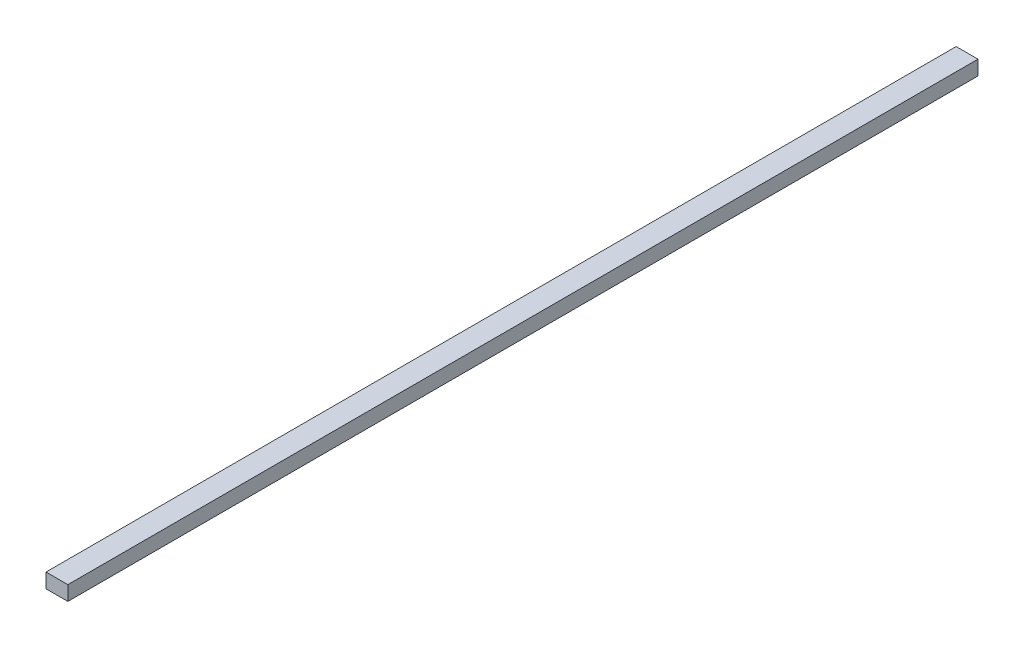
ISO-10303-21;
HEADER;
FILE_DESCRIPTION(('STEP AP214'),'2;1');
FILE_NAME('part.step','',(''),(''),'','','');
FILE_SCHEMA(('AUTOMOTIVE_DESIGN { 1 0 10303 214 1 1 1 1 }'));
ENDSEC;
DATA;
#1=APPLICATION_CONTEXT('core data for automotive mechanical design processes');
#2=APPLICATION_PROTOCOL_DEFINITION('international standard','automotive_design',2000,#1);
#3=PRODUCT_CONTEXT('',#1,'mechanical');
#4=PRODUCT('Part','Part','',(#3));
#5=PRODUCT_RELATED_PRODUCT_CATEGORY('part','',(#4));
#6=PRODUCT_DEFINITION_FORMATION('','',#4);
#7=PRODUCT_DEFINITION_CONTEXT('part definition',#1,'design');
#8=PRODUCT_DEFINITION('design','',#6,#7);
#9=PRODUCT_DEFINITION_SHAPE('','',#8);
#10=(LENGTH_UNIT() NAMED_UNIT(*) SI_UNIT(.MILLI.,.METRE.));
#11=(NAMED_UNIT(*) PLANE_ANGLE_UNIT() SI_UNIT($,.RADIAN.));
#12=(NAMED_UNIT(*) SI_UNIT($,.STERADIAN.) SOLID_ANGLE_UNIT());
#13=UNCERTAINTY_MEASURE_WITH_UNIT(LENGTH_MEASURE(1.E-05),#10,'distance_accuracy_value','');
#14=(GEOMETRIC_REPRESENTATION_CONTEXT(3) GLOBAL_UNCERTAINTY_ASSIGNED_CONTEXT((#13)) GLOBAL_UNIT_ASSIGNED_CONTEXT((#10,
#11,#12)) REPRESENTATION_CONTEXT('',''));
#15=CARTESIAN_POINT('',(0.,0.,0.));
#16=DIRECTION('',(0.,0.,1.));
#17=DIRECTION('',(1.,0.,0.));
#18=AXIS2_PLACEMENT_3D('',#15,#16,#17);
#19=CARTESIAN_POINT('',(0.,8.,0.));
#20=DIRECTION('',(-1.,0.,0.));
#21=DIRECTION('',(0.,0.,1.));
#22=AXIS2_PLACEMENT_3D('',#19,#20,#21);
#23=PLANE('',#22);
#24=DIRECTION('',(0.,0.,-1.));
#25=VECTOR('',#24,1.);
#26=CARTESIAN_POINT('',(0.,0.,0.));
#27=LINE('',#26,#25);
#28=CARTESIAN_POINT('',(0.,0.,0.));
#29=VERTEX_POINT('',#28);
#30=CARTESIAN_POINT('',(0.,0.,-500.));
#31=VERTEX_POINT('',#30);
#32=EDGE_CURVE('E99',#29,#31,#27,.T.);
#33=ORIENTED_EDGE('',*,*,#32,.F.);
#34=DIRECTION('',(0.,-1.,0.));
#35=VECTOR('',#34,1.);
#36=CARTESIAN_POINT('',(0.,8.,0.));
#37=LINE('',#36,#35);
#38=CARTESIAN_POINT('',(0.,8.,0.));
#39=VERTEX_POINT('',#38);
#40=EDGE_CURVE('E11',#39,#29,#37,.T.);
#41=ORIENTED_EDGE('',*,*,#40,.F.);
#42=DIRECTION('',(0.,0.,-1.));
#43=VECTOR('',#42,1.);
#44=CARTESIAN_POINT('',(0.,8.,0.));
#45=LINE('',#44,#43);
#46=CARTESIAN_POINT('',(0.,8.,-500.));
#47=VERTEX_POINT('',#46);
#48=EDGE_CURVE('E94',#39,#47,#45,.T.);
#49=ORIENTED_EDGE('',*,*,#48,.T.);
#50=DIRECTION('',(0.,-1.,0.));
#51=VECTOR('',#50,1.);
#52=CARTESIAN_POINT('',(0.,8.,-500.));
#53=LINE('',#52,#51);
#54=EDGE_CURVE('E37',#47,#31,#53,.T.);
#55=ORIENTED_EDGE('',*,*,#54,.T.);
#56=EDGE_LOOP('',(#33,#41,#49,#55));
#57=FACE_BOUND('',#56,.T.);
#58=ADVANCED_FACE('F34',(#57),#23,.T.);
#59=CARTESIAN_POINT('',(0.,8.,0.));
#60=DIRECTION('',(0.,0.,-1.));
#61=DIRECTION('',(-1.,0.,0.));
#62=AXIS2_PLACEMENT_3D('',#59,#60,#61);
#63=PLANE('',#62);
#64=DIRECTION('',(1.,0.,0.));
#65=VECTOR('',#64,1.);
#66=CARTESIAN_POINT('',(0.,0.,0.));
#67=LINE('',#66,#65);
#68=CARTESIAN_POINT('',(12.,0.,0.));
#69=VERTEX_POINT('',#68);
#70=EDGE_CURVE('E67',#29,#69,#67,.T.);
#71=ORIENTED_EDGE('',*,*,#70,.T.);
#72=DIRECTION('',(0.,-1.,0.));
#73=VECTOR('',#72,1.);
#74=CARTESIAN_POINT('',(12.,8.,0.));
#75=LINE('',#74,#73);
#76=CARTESIAN_POINT('',(12.,8.,0.));
#77=VERTEX_POINT('',#76);
#78=EDGE_CURVE('E43',#77,#69,#75,.T.);
#79=ORIENTED_EDGE('',*,*,#78,.F.);
#80=DIRECTION('',(1.,0.,0.));
#81=VECTOR('',#80,1.);
#82=CARTESIAN_POINT('',(0.,8.,0.));
#83=LINE('',#82,#81);
#84=EDGE_CURVE('E84',#39,#77,#83,.T.);
#85=ORIENTED_EDGE('',*,*,#84,.F.);
#86=ORIENTED_EDGE('',*,*,#40,.T.);
#87=EDGE_LOOP('',(#71,#79,#85,#86));
#88=FACE_BOUND('',#87,.T.);
#89=ADVANCED_FACE('F109',(#88),#63,.F.);
#90=CARTESIAN_POINT('',(12.,8.,0.));
#91=DIRECTION('',(-1.,0.,0.));
#92=DIRECTION('',(0.,0.,1.));
#93=AXIS2_PLACEMENT_3D('',#90,#91,#92);
#94=PLANE('',#93);
#95=DIRECTION('',(0.,0.,-1.));
#96=VECTOR('',#95,1.);
#97=CARTESIAN_POINT('',(12.,0.,0.));
#98=LINE('',#97,#96);
#99=CARTESIAN_POINT('',(12.,0.,-500.));
#100=VERTEX_POINT('',#99);
#101=EDGE_CURVE('E91',#69,#100,#98,.T.);
#102=ORIENTED_EDGE('',*,*,#101,.T.);
#103=DIRECTION('',(0.,-1.,0.));
#104=VECTOR('',#103,1.);
#105=CARTESIAN_POINT('',(12.,8.,-500.));
#106=LINE('',#105,#104);
#107=CARTESIAN_POINT('',(12.,8.,-500.));
#108=VERTEX_POINT('',#107);
#109=EDGE_CURVE('E88',#108,#100,#106,.T.);
#110=ORIENTED_EDGE('',*,*,#109,.F.);
#111=DIRECTION('',(0.,0.,-1.));
#112=VECTOR('',#111,1.);
#113=CARTESIAN_POINT('',(12.,8.,0.));
#114=LINE('',#113,#112);
#115=EDGE_CURVE('E79',#77,#108,#114,.T.);
#116=ORIENTED_EDGE('',*,*,#115,.F.);
#117=ORIENTED_EDGE('',*,*,#78,.T.);
#118=EDGE_LOOP('',(#102,#110,#116,#117));
#119=FACE_BOUND('',#118,.T.);
#120=ADVANCED_FACE('F89',(#119),#94,.F.);
#121=CARTESIAN_POINT('',(0.,8.,-500.));
#122=DIRECTION('',(0.,0.,-1.));
#123=DIRECTION('',(-1.,0.,0.));
#124=AXIS2_PLACEMENT_3D('',#121,#122,#123);
#125=PLANE('',#124);
#126=DIRECTION('',(1.,0.,0.));
#127=VECTOR('',#126,1.);
#128=CARTESIAN_POINT('',(0.,0.,-500.));
#129=LINE('',#128,#127);
#130=EDGE_CURVE('E102',#31,#100,#129,.T.);
#131=ORIENTED_EDGE('',*,*,#130,.F.);
#132=ORIENTED_EDGE('',*,*,#54,.F.);
#133=DIRECTION('',(1.,0.,0.));
#134=VECTOR('',#133,1.);
#135=CARTESIAN_POINT('',(0.,8.,-500.));
#136=LINE('',#135,#134);
#137=EDGE_CURVE('E83',#47,#108,#136,.T.);
#138=ORIENTED_EDGE('',*,*,#137,.T.);
#139=ORIENTED_EDGE('',*,*,#109,.T.);
#140=EDGE_LOOP('',(#131,#132,#138,#139));
#141=FACE_BOUND('',#140,.T.);
#142=ADVANCED_FACE('F93',(#141),#125,.T.);
#143=CARTESIAN_POINT('',(0.,8.,0.));
#144=DIRECTION('',(0.,-1.,0.));
#145=DIRECTION('',(0.,0.,-1.));
#146=AXIS2_PLACEMENT_3D('',#143,#144,#145);
#147=PLANE('',#146);
#148=ORIENTED_EDGE('',*,*,#48,.F.);
#149=ORIENTED_EDGE('',*,*,#84,.T.);
#150=ORIENTED_EDGE('',*,*,#115,.T.);
#151=ORIENTED_EDGE('',*,*,#137,.F.);
#152=EDGE_LOOP('',(#148,#149,#150,#151));
#153=FACE_BOUND('',#152,.T.);
#154=ADVANCED_FACE('F82',(#153),#147,.F.);
#155=CARTESIAN_POINT('',(0.,0.,0.));
#156=DIRECTION('',(0.,-1.,0.));
#157=DIRECTION('',(0.,0.,-1.));
#158=AXIS2_PLACEMENT_3D('',#155,#156,#157);
#159=PLANE('',#158);
#160=ORIENTED_EDGE('',*,*,#32,.T.);
#161=ORIENTED_EDGE('',*,*,#130,.T.);
#162=ORIENTED_EDGE('',*,*,#101,.F.);
#163=ORIENTED_EDGE('',*,*,#70,.F.);
#164=EDGE_LOOP('',(#160,#161,#162,#163));
#165=FACE_BOUND('',#164,.T.);
#166=ADVANCED_FACE('F107',(#165),#159,.T.);
#167=CLOSED_SHELL('',(#58,#89,#120,#142,#154,#166));
#168=MANIFOLD_SOLID_BREP('B2',#167);
#169=ADVANCED_BREP_SHAPE_REPRESENTATION('',(#18,#168),#14);
#170=SHAPE_DEFINITION_REPRESENTATION(#9,#169);
ENDSEC;
END-ISO-10303-21;
